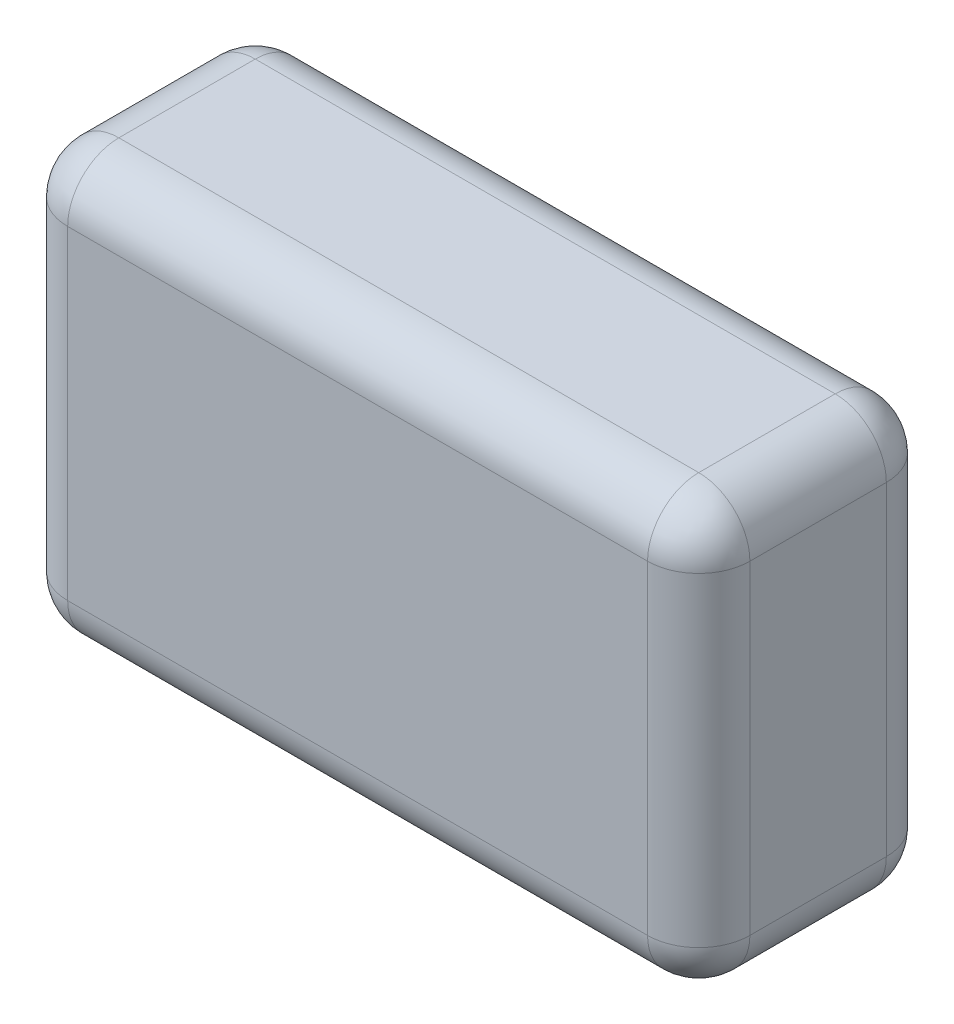
ISO-10303-21;
HEADER;
FILE_DESCRIPTION(('STEP AP214'),'2;1');
FILE_NAME('part.step','',(''),(''),'','','');
FILE_SCHEMA(('AUTOMOTIVE_DESIGN { 1 0 10303 214 1 1 1 1 }'));
ENDSEC;
DATA;
#1=APPLICATION_CONTEXT('core data for automotive mechanical design processes');
#2=APPLICATION_PROTOCOL_DEFINITION('international standard','automotive_design',2000,#1);
#3=PRODUCT_CONTEXT('',#1,'mechanical');
#4=PRODUCT('Part','Part','',(#3));
#5=PRODUCT_RELATED_PRODUCT_CATEGORY('part','',(#4));
#6=PRODUCT_DEFINITION_FORMATION('','',#4);
#7=PRODUCT_DEFINITION_CONTEXT('part definition',#1,'design');
#8=PRODUCT_DEFINITION('design','',#6,#7);
#9=PRODUCT_DEFINITION_SHAPE('','',#8);
#10=(LENGTH_UNIT() NAMED_UNIT(*) SI_UNIT(.MILLI.,.METRE.));
#11=(NAMED_UNIT(*) PLANE_ANGLE_UNIT() SI_UNIT($,.RADIAN.));
#12=(NAMED_UNIT(*) SI_UNIT($,.STERADIAN.) SOLID_ANGLE_UNIT());
#13=UNCERTAINTY_MEASURE_WITH_UNIT(LENGTH_MEASURE(1.E-05),#10,'distance_accuracy_value','');
#14=(GEOMETRIC_REPRESENTATION_CONTEXT(3) GLOBAL_UNCERTAINTY_ASSIGNED_CONTEXT((#13)) GLOBAL_UNIT_ASSIGNED_CONTEXT((#10,
#11,#12)) REPRESENTATION_CONTEXT('',''));
#15=CARTESIAN_POINT('',(0.,0.,0.));
#16=DIRECTION('',(0.,0.,1.));
#17=DIRECTION('',(1.,0.,0.));
#18=AXIS2_PLACEMENT_3D('',#15,#16,#17);
#19=CARTESIAN_POINT('',(20.,25.,-7.));
#20=DIRECTION('',(-1.,0.,0.));
#21=DIRECTION('',(0.,0.,1.));
#22=AXIS2_PLACEMENT_3D('',#19,#20,#21);
#23=PLANE('',#22);
#24=DIRECTION('',(0.,-1.,0.));
#25=VECTOR('',#24,1.);
#26=CARTESIAN_POINT('',(20.,25.,4.));
#27=LINE('',#26,#25);
#28=CARTESIAN_POINT('',(20.,22.,4.));
#29=VERTEX_POINT('',#28);
#30=CARTESIAN_POINT('',(20.,3.,4.));
#31=VERTEX_POINT('',#30);
#32=EDGE_CURVE('E157',#29,#31,#27,.T.);
#33=ORIENTED_EDGE('',*,*,#32,.T.);
#34=DIRECTION('',(0.,0.,-1.));
#35=VECTOR('',#34,1.);
#36=CARTESIAN_POINT('',(20.,3.,-7.));
#37=LINE('',#36,#35);
#38=CARTESIAN_POINT('',(20.,3.,-4.));
#39=VERTEX_POINT('',#38);
#40=EDGE_CURVE('E269',#31,#39,#37,.T.);
#41=ORIENTED_EDGE('',*,*,#40,.T.);
#42=DIRECTION('',(0.,-1.,0.));
#43=VECTOR('',#42,1.);
#44=CARTESIAN_POINT('',(20.,25.,-4.));
#45=LINE('',#44,#43);
#46=CARTESIAN_POINT('',(20.,22.,-4.));
#47=VERTEX_POINT('',#46);
#48=EDGE_CURVE('E272',#39,#47,#45,.F.);
#49=ORIENTED_EDGE('',*,*,#48,.T.);
#50=DIRECTION('',(0.,0.,-1.));
#51=VECTOR('',#50,1.);
#52=CARTESIAN_POINT('',(20.,22.,7.));
#53=LINE('',#52,#51);
#54=EDGE_CURVE('E275',#47,#29,#53,.F.);
#55=ORIENTED_EDGE('',*,*,#54,.T.);
#56=EDGE_LOOP('',(#33,#41,#49,#55));
#57=FACE_BOUND('',#56,.T.);
#58=ADVANCED_FACE('F37',(#57),#23,.F.);
#59=CARTESIAN_POINT('',(-20.,25.,-7.));
#60=DIRECTION('',(0.,0.,1.));
#61=DIRECTION('',(1.,0.,0.));
#62=AXIS2_PLACEMENT_3D('',#59,#60,#61);
#63=PLANE('',#62);
#64=DIRECTION('',(-1.,0.,0.));
#65=VECTOR('',#64,1.);
#66=CARTESIAN_POINT('',(20.,22.,-7.));
#67=LINE('',#66,#65);
#68=CARTESIAN_POINT('',(-17.,22.,-7.));
#69=VERTEX_POINT('',#68);
#70=CARTESIAN_POINT('',(17.,22.,-7.));
#71=VERTEX_POINT('',#70);
#72=EDGE_CURVE('E264',#69,#71,#67,.F.);
#73=ORIENTED_EDGE('',*,*,#72,.T.);
#74=DIRECTION('',(0.,-1.,0.));
#75=VECTOR('',#74,1.);
#76=CARTESIAN_POINT('',(17.,25.,-7.));
#77=LINE('',#76,#75);
#78=CARTESIAN_POINT('',(17.,3.,-7.));
#79=VERTEX_POINT('',#78);
#80=EDGE_CURVE('E261',#71,#79,#77,.T.);
#81=ORIENTED_EDGE('',*,*,#80,.T.);
#82=DIRECTION('',(-1.,0.,0.));
#83=VECTOR('',#82,1.);
#84=CARTESIAN_POINT('',(-20.,3.,-7.));
#85=LINE('',#84,#83);
#86=CARTESIAN_POINT('',(-17.,3.,-7.));
#87=VERTEX_POINT('',#86);
#88=EDGE_CURVE('E266',#79,#87,#85,.T.);
#89=ORIENTED_EDGE('',*,*,#88,.T.);
#90=DIRECTION('',(0.,-1.,0.));
#91=VECTOR('',#90,1.);
#92=CARTESIAN_POINT('',(-17.,25.,-7.));
#93=LINE('',#92,#91);
#94=EDGE_CURVE('E217',#87,#69,#93,.F.);
#95=ORIENTED_EDGE('',*,*,#94,.T.);
#96=EDGE_LOOP('',(#73,#81,#89,#95));
#97=FACE_BOUND('',#96,.T.);
#98=ADVANCED_FACE('F308',(#97),#63,.F.);
#99=CARTESIAN_POINT('',(-20.,25.,-7.));
#100=DIRECTION('',(1.,0.,0.));
#101=DIRECTION('',(0.,0.,-1.));
#102=AXIS2_PLACEMENT_3D('',#99,#100,#101);
#103=PLANE('',#102);
#104=DIRECTION('',(0.,0.,1.));
#105=VECTOR('',#104,1.);
#106=CARTESIAN_POINT('',(-20.,22.,-7.));
#107=LINE('',#106,#105);
#108=CARTESIAN_POINT('',(-20.,22.,4.));
#109=VERTEX_POINT('',#108);
#110=CARTESIAN_POINT('',(-20.,22.,-4.));
#111=VERTEX_POINT('',#110);
#112=EDGE_CURVE('E46',#109,#111,#107,.F.);
#113=ORIENTED_EDGE('',*,*,#112,.T.);
#114=DIRECTION('',(0.,-1.,0.));
#115=VECTOR('',#114,1.);
#116=CARTESIAN_POINT('',(-20.,25.,-4.));
#117=LINE('',#116,#115);
#118=CARTESIAN_POINT('',(-20.,3.,-4.));
#119=VERTEX_POINT('',#118);
#120=EDGE_CURVE('E11',#111,#119,#117,.T.);
#121=ORIENTED_EDGE('',*,*,#120,.T.);
#122=DIRECTION('',(0.,0.,1.));
#123=VECTOR('',#122,1.);
#124=CARTESIAN_POINT('',(-20.,3.,-7.));
#125=LINE('',#124,#123);
#126=CARTESIAN_POINT('',(-20.,3.,4.));
#127=VERTEX_POINT('',#126);
#128=EDGE_CURVE('E220',#119,#127,#125,.T.);
#129=ORIENTED_EDGE('',*,*,#128,.T.);
#130=DIRECTION('',(0.,-1.,0.));
#131=VECTOR('',#130,1.);
#132=CARTESIAN_POINT('',(-20.,25.,4.));
#133=LINE('',#132,#131);
#134=EDGE_CURVE('E57',#127,#109,#133,.F.);
#135=ORIENTED_EDGE('',*,*,#134,.T.);
#136=EDGE_LOOP('',(#113,#121,#129,#135));
#137=FACE_BOUND('',#136,.T.);
#138=ADVANCED_FACE('F219',(#137),#103,.F.);
#139=CARTESIAN_POINT('',(-20.,25.,7.));
#140=DIRECTION('',(0.,0.,-1.));
#141=DIRECTION('',(-1.,0.,0.));
#142=AXIS2_PLACEMENT_3D('',#139,#140,#141);
#143=PLANE('',#142);
#144=DIRECTION('',(0.,-1.,0.));
#145=VECTOR('',#144,1.);
#146=CARTESIAN_POINT('',(-17.,25.,7.));
#147=LINE('',#146,#145);
#148=CARTESIAN_POINT('',(-17.,22.,7.));
#149=VERTEX_POINT('',#148);
#150=CARTESIAN_POINT('',(-17.,3.,7.));
#151=VERTEX_POINT('',#150);
#152=EDGE_CURVE('E135',#149,#151,#147,.T.);
#153=ORIENTED_EDGE('',*,*,#152,.T.);
#154=DIRECTION('',(1.,0.,0.));
#155=VECTOR('',#154,1.);
#156=CARTESIAN_POINT('',(-20.,3.,7.));
#157=LINE('',#156,#155);
#158=CARTESIAN_POINT('',(17.,3.,7.));
#159=VERTEX_POINT('',#158);
#160=EDGE_CURVE('E131',#151,#159,#157,.T.);
#161=ORIENTED_EDGE('',*,*,#160,.T.);
#162=DIRECTION('',(0.,-1.,0.));
#163=VECTOR('',#162,1.);
#164=CARTESIAN_POINT('',(17.,25.,7.));
#165=LINE('',#164,#163);
#166=CARTESIAN_POINT('',(17.,22.,7.));
#167=VERTEX_POINT('',#166);
#168=EDGE_CURVE('E125',#159,#167,#165,.F.);
#169=ORIENTED_EDGE('',*,*,#168,.T.);
#170=DIRECTION('',(1.,0.,0.));
#171=VECTOR('',#170,1.);
#172=CARTESIAN_POINT('',(-20.,22.,7.));
#173=LINE('',#172,#171);
#174=EDGE_CURVE('E128',#167,#149,#173,.F.);
#175=ORIENTED_EDGE('',*,*,#174,.T.);
#176=EDGE_LOOP('',(#153,#161,#169,#175));
#177=FACE_BOUND('',#176,.T.);
#178=ADVANCED_FACE('F127',(#177),#143,.F.);
#179=CARTESIAN_POINT('',(0.,25.,0.));
#180=DIRECTION('',(0.,1.,0.));
#181=DIRECTION('',(0.,0.,1.));
#182=AXIS2_PLACEMENT_3D('',#179,#180,#181);
#183=PLANE('',#182);
#184=DIRECTION('',(0.,0.,-1.));
#185=VECTOR('',#184,1.);
#186=CARTESIAN_POINT('',(17.,25.,-7.));
#187=LINE('',#186,#185);
#188=CARTESIAN_POINT('',(17.,25.,4.));
#189=VERTEX_POINT('',#188);
#190=CARTESIAN_POINT('',(17.,25.,-4.));
#191=VERTEX_POINT('',#190);
#192=EDGE_CURVE('E257',#189,#191,#187,.T.);
#193=ORIENTED_EDGE('',*,*,#192,.T.);
#194=DIRECTION('',(-1.,0.,0.));
#195=VECTOR('',#194,1.);
#196=CARTESIAN_POINT('',(-20.,25.,-4.));
#197=LINE('',#196,#195);
#198=CARTESIAN_POINT('',(-17.,25.,-4.));
#199=VERTEX_POINT('',#198);
#200=EDGE_CURVE('E224',#191,#199,#197,.T.);
#201=ORIENTED_EDGE('',*,*,#200,.T.);
#202=DIRECTION('',(0.,0.,1.));
#203=VECTOR('',#202,1.);
#204=CARTESIAN_POINT('',(-17.,25.,7.));
#205=LINE('',#204,#203);
#206=CARTESIAN_POINT('',(-17.,25.,4.));
#207=VERTEX_POINT('',#206);
#208=EDGE_CURVE('E255',#199,#207,#205,.T.);
#209=ORIENTED_EDGE('',*,*,#208,.T.);
#210=DIRECTION('',(1.,0.,0.));
#211=VECTOR('',#210,1.);
#212=CARTESIAN_POINT('',(20.,25.,4.));
#213=LINE('',#212,#211);
#214=EDGE_CURVE('E259',#207,#189,#213,.T.);
#215=ORIENTED_EDGE('',*,*,#214,.T.);
#216=EDGE_LOOP('',(#193,#201,#209,#215));
#217=FACE_BOUND('',#216,.T.);
#218=ADVANCED_FACE('F519',(#217),#183,.T.);
#219=CARTESIAN_POINT('',(0.,0.,0.));
#220=DIRECTION('',(0.,1.,0.));
#221=DIRECTION('',(0.,0.,1.));
#222=AXIS2_PLACEMENT_3D('',#219,#220,#221);
#223=PLANE('',#222);
#224=DIRECTION('',(0.,0.,-1.));
#225=VECTOR('',#224,1.);
#226=CARTESIAN_POINT('',(17.,0.,0.));
#227=LINE('',#226,#225);
#228=CARTESIAN_POINT('',(17.,0.,-4.));
#229=VERTEX_POINT('',#228);
#230=CARTESIAN_POINT('',(17.,0.,4.));
#231=VERTEX_POINT('',#230);
#232=EDGE_CURVE('E279',#229,#231,#227,.F.);
#233=ORIENTED_EDGE('',*,*,#232,.T.);
#234=DIRECTION('',(1.,0.,0.));
#235=VECTOR('',#234,1.);
#236=CARTESIAN_POINT('',(0.,0.,4.));
#237=LINE('',#236,#235);
#238=CARTESIAN_POINT('',(-17.,0.,4.));
#239=VERTEX_POINT('',#238);
#240=EDGE_CURVE('E277',#231,#239,#237,.F.);
#241=ORIENTED_EDGE('',*,*,#240,.T.);
#242=DIRECTION('',(0.,0.,1.));
#243=VECTOR('',#242,1.);
#244=CARTESIAN_POINT('',(-17.,0.,0.));
#245=LINE('',#244,#243);
#246=CARTESIAN_POINT('',(-17.,0.,-4.));
#247=VERTEX_POINT('',#246);
#248=EDGE_CURVE('E237',#239,#247,#245,.F.);
#249=ORIENTED_EDGE('',*,*,#248,.T.);
#250=DIRECTION('',(-1.,0.,0.));
#251=VECTOR('',#250,1.);
#252=CARTESIAN_POINT('',(0.,0.,-4.));
#253=LINE('',#252,#251);
#254=EDGE_CURVE('E281',#247,#229,#253,.F.);
#255=ORIENTED_EDGE('',*,*,#254,.T.);
#256=EDGE_LOOP('',(#233,#241,#249,#255));
#257=FACE_BOUND('',#256,.T.);
#258=ADVANCED_FACE('F287',(#257),#223,.F.);
#259=CARTESIAN_POINT('',(0.,22.,-4.));
#260=DIRECTION('',(1.,0.,0.));
#261=DIRECTION('',(0.,0.,-1.));
#262=AXIS2_PLACEMENT_3D('',#259,#260,#261);
#263=CYLINDRICAL_SURFACE('',#262,3.);
#264=CARTESIAN_POINT('',(-17.,22.,-4.));
#265=DIRECTION('',(-1.,0.,0.));
#266=DIRECTION('',(0.,0.,1.));
#267=AXIS2_PLACEMENT_3D('',#264,#265,#266);
#268=CIRCLE('',#267,3.);
#269=EDGE_CURVE('E41',#199,#69,#268,.T.);
#270=ORIENTED_EDGE('',*,*,#269,.F.);
#271=ORIENTED_EDGE('',*,*,#200,.F.);
#272=CARTESIAN_POINT('',(17.,22.,-4.));
#273=DIRECTION('',(1.,0.,0.));
#274=DIRECTION('',(0.,1.,0.));
#275=AXIS2_PLACEMENT_3D('',#272,#273,#274);
#276=CIRCLE('',#275,3.);
#277=EDGE_CURVE('E196',#71,#191,#276,.T.);
#278=ORIENTED_EDGE('',*,*,#277,.F.);
#279=ORIENTED_EDGE('',*,*,#72,.F.);
#280=EDGE_LOOP('',(#270,#271,#278,#279));
#281=FACE_BOUND('',#280,.T.);
#282=ADVANCED_FACE('F39',(#281),#263,.T.);
#283=CARTESIAN_POINT('',(-17.,22.,-4.));
#284=DIRECTION('',(0.,0.,-1.));
#285=DIRECTION('',(-1.,0.,0.));
#286=AXIS2_PLACEMENT_3D('',#283,#284,#285);
#287=SPHERICAL_SURFACE('',#286,3.);
#288=CARTESIAN_POINT('',(-17.,22.,-4.));
#289=DIRECTION('',(0.,0.,-1.));
#290=DIRECTION('',(-1.,0.,0.));
#291=AXIS2_PLACEMENT_3D('',#288,#289,#290);
#292=CIRCLE('',#291,3.);
#293=EDGE_CURVE('E192',#199,#111,#292,.F.);
#294=ORIENTED_EDGE('',*,*,#293,.F.);
#295=ORIENTED_EDGE('',*,*,#269,.T.);
#296=CARTESIAN_POINT('',(-17.,22.,-4.));
#297=DIRECTION('',(0.,1.,0.));
#298=DIRECTION('',(0.,0.,1.));
#299=AXIS2_PLACEMENT_3D('',#296,#297,#298);
#300=CIRCLE('',#299,3.);
#301=EDGE_CURVE('E194',#111,#69,#300,.F.);
#302=ORIENTED_EDGE('',*,*,#301,.F.);
#303=EDGE_LOOP('',(#294,#295,#302));
#304=FACE_BOUND('',#303,.T.);
#305=ADVANCED_FACE('F207',(#304),#287,.T.);
#306=CARTESIAN_POINT('',(17.,22.,-4.));
#307=DIRECTION('',(0.,1.,0.));
#308=DIRECTION('',(0.,0.,1.));
#309=AXIS2_PLACEMENT_3D('',#306,#307,#308);
#310=SPHERICAL_SURFACE('',#309,3.);
#311=CARTESIAN_POINT('',(17.,22.,-4.));
#312=DIRECTION('',(0.,1.,0.));
#313=DIRECTION('',(0.,0.,1.));
#314=AXIS2_PLACEMENT_3D('',#311,#312,#313);
#315=CIRCLE('',#314,3.);
#316=EDGE_CURVE('E186',#71,#47,#315,.F.);
#317=ORIENTED_EDGE('',*,*,#316,.F.);
#318=ORIENTED_EDGE('',*,*,#277,.T.);
#319=CARTESIAN_POINT('',(17.,22.,-4.));
#320=DIRECTION('',(0.,0.,-1.));
#321=DIRECTION('',(-1.,0.,0.));
#322=AXIS2_PLACEMENT_3D('',#319,#320,#321);
#323=CIRCLE('',#322,3.);
#324=EDGE_CURVE('E189',#47,#191,#323,.F.);
#325=ORIENTED_EDGE('',*,*,#324,.F.);
#326=EDGE_LOOP('',(#317,#318,#325));
#327=FACE_BOUND('',#326,.T.);
#328=ADVANCED_FACE('F484',(#327),#310,.T.);
#329=CARTESIAN_POINT('',(-17.,25.,-4.));
#330=DIRECTION('',(0.,-1.,0.));
#331=DIRECTION('',(0.,0.,-1.));
#332=AXIS2_PLACEMENT_3D('',#329,#330,#331);
#333=CYLINDRICAL_SURFACE('',#332,3.);
#334=ORIENTED_EDGE('',*,*,#301,.T.);
#335=ORIENTED_EDGE('',*,*,#94,.F.);
#336=CARTESIAN_POINT('',(-17.,3.,-4.));
#337=DIRECTION('',(0.,-1.,0.));
#338=DIRECTION('',(0.,0.,-1.));
#339=AXIS2_PLACEMENT_3D('',#336,#337,#338);
#340=CIRCLE('',#339,3.);
#341=EDGE_CURVE('E180',#119,#87,#340,.T.);
#342=ORIENTED_EDGE('',*,*,#341,.F.);
#343=ORIENTED_EDGE('',*,*,#120,.F.);
#344=EDGE_LOOP('',(#334,#335,#342,#343));
#345=FACE_BOUND('',#344,.T.);
#346=ADVANCED_FACE('F215',(#345),#333,.T.);
#347=CARTESIAN_POINT('',(-17.,22.,0.));
#348=DIRECTION('',(0.,0.,-1.));
#349=DIRECTION('',(-1.,0.,0.));
#350=AXIS2_PLACEMENT_3D('',#347,#348,#349);
#351=CYLINDRICAL_SURFACE('',#350,3.);
#352=ORIENTED_EDGE('',*,*,#293,.T.);
#353=ORIENTED_EDGE('',*,*,#112,.F.);
#354=CARTESIAN_POINT('',(-17.,22.,4.));
#355=DIRECTION('',(0.,0.,1.));
#356=DIRECTION('',(1.,0.,0.));
#357=AXIS2_PLACEMENT_3D('',#354,#355,#356);
#358=CIRCLE('',#357,3.);
#359=EDGE_CURVE('E177',#207,#109,#358,.T.);
#360=ORIENTED_EDGE('',*,*,#359,.F.);
#361=ORIENTED_EDGE('',*,*,#208,.F.);
#362=EDGE_LOOP('',(#352,#353,#360,#361));
#363=FACE_BOUND('',#362,.T.);
#364=ADVANCED_FACE('F464',(#363),#351,.T.);
#365=CARTESIAN_POINT('',(0.,22.,4.));
#366=DIRECTION('',(-1.,0.,0.));
#367=DIRECTION('',(0.,0.,1.));
#368=AXIS2_PLACEMENT_3D('',#365,#366,#367);
#369=CYLINDRICAL_SURFACE('',#368,3.);
#370=CARTESIAN_POINT('',(17.,22.,4.));
#371=DIRECTION('',(1.,0.,0.));
#372=DIRECTION('',(0.,0.,-1.));
#373=AXIS2_PLACEMENT_3D('',#370,#371,#372);
#374=CIRCLE('',#373,3.);
#375=EDGE_CURVE('E142',#189,#167,#374,.T.);
#376=ORIENTED_EDGE('',*,*,#375,.F.);
#377=ORIENTED_EDGE('',*,*,#214,.F.);
#378=CARTESIAN_POINT('',(-17.,22.,4.));
#379=DIRECTION('',(-1.,0.,0.));
#380=DIRECTION('',(0.,0.,1.));
#381=AXIS2_PLACEMENT_3D('',#378,#379,#380);
#382=CIRCLE('',#381,3.);
#383=EDGE_CURVE('E145',#149,#207,#382,.T.);
#384=ORIENTED_EDGE('',*,*,#383,.F.);
#385=ORIENTED_EDGE('',*,*,#174,.F.);
#386=EDGE_LOOP('',(#376,#377,#384,#385));
#387=FACE_BOUND('',#386,.T.);
#388=ADVANCED_FACE('F140',(#387),#369,.T.);
#389=CARTESIAN_POINT('',(17.,22.,0.));
#390=DIRECTION('',(0.,0.,1.));
#391=DIRECTION('',(1.,0.,0.));
#392=AXIS2_PLACEMENT_3D('',#389,#390,#391);
#393=CYLINDRICAL_SURFACE('',#392,3.);
#394=ORIENTED_EDGE('',*,*,#324,.T.);
#395=ORIENTED_EDGE('',*,*,#192,.F.);
#396=CARTESIAN_POINT('',(17.,22.,4.));
#397=DIRECTION('',(0.,0.,1.));
#398=DIRECTION('',(0.,-1.,0.));
#399=AXIS2_PLACEMENT_3D('',#396,#397,#398);
#400=CIRCLE('',#399,3.);
#401=EDGE_CURVE('E154',#29,#189,#400,.T.);
#402=ORIENTED_EDGE('',*,*,#401,.F.);
#403=ORIENTED_EDGE('',*,*,#54,.F.);
#404=EDGE_LOOP('',(#394,#395,#402,#403));
#405=FACE_BOUND('',#404,.T.);
#406=ADVANCED_FACE('F443',(#405),#393,.T.);
#407=CARTESIAN_POINT('',(17.,25.,-4.));
#408=DIRECTION('',(0.,-1.,0.));
#409=DIRECTION('',(0.,0.,-1.));
#410=AXIS2_PLACEMENT_3D('',#407,#408,#409);
#411=CYLINDRICAL_SURFACE('',#410,3.);
#412=ORIENTED_EDGE('',*,*,#316,.T.);
#413=ORIENTED_EDGE('',*,*,#48,.F.);
#414=CARTESIAN_POINT('',(17.,3.,-4.));
#415=DIRECTION('',(0.,-1.,0.));
#416=DIRECTION('',(0.,0.,-1.));
#417=AXIS2_PLACEMENT_3D('',#414,#415,#416);
#418=CIRCLE('',#417,3.);
#419=EDGE_CURVE('E172',#79,#39,#418,.T.);
#420=ORIENTED_EDGE('',*,*,#419,.F.);
#421=ORIENTED_EDGE('',*,*,#80,.F.);
#422=EDGE_LOOP('',(#412,#413,#420,#421));
#423=FACE_BOUND('',#422,.T.);
#424=ADVANCED_FACE('F305',(#423),#411,.T.);
#425=CARTESIAN_POINT('',(-20.,3.,-4.));
#426=DIRECTION('',(-1.,0.,0.));
#427=DIRECTION('',(0.,0.,1.));
#428=AXIS2_PLACEMENT_3D('',#425,#426,#427);
#429=CYLINDRICAL_SURFACE('',#428,3.);
#430=CARTESIAN_POINT('',(-17.,3.,-4.));
#431=DIRECTION('',(-1.,0.,0.));
#432=DIRECTION('',(0.,0.,1.));
#433=AXIS2_PLACEMENT_3D('',#430,#431,#432);
#434=CIRCLE('',#433,3.);
#435=EDGE_CURVE('E183',#87,#247,#434,.T.);
#436=ORIENTED_EDGE('',*,*,#435,.F.);
#437=ORIENTED_EDGE('',*,*,#88,.F.);
#438=CARTESIAN_POINT('',(17.,3.,-4.));
#439=DIRECTION('',(1.,0.,0.));
#440=DIRECTION('',(0.,0.,-1.));
#441=AXIS2_PLACEMENT_3D('',#438,#439,#440);
#442=CIRCLE('',#441,3.);
#443=EDGE_CURVE('E170',#229,#79,#442,.T.);
#444=ORIENTED_EDGE('',*,*,#443,.F.);
#445=ORIENTED_EDGE('',*,*,#254,.F.);
#446=EDGE_LOOP('',(#436,#437,#444,#445));
#447=FACE_BOUND('',#446,.T.);
#448=ADVANCED_FACE('F291',(#447),#429,.T.);
#449=CARTESIAN_POINT('',(-17.,3.,-4.));
#450=DIRECTION('',(0.,0.,-1.));
#451=DIRECTION('',(0.,1.,0.));
#452=AXIS2_PLACEMENT_3D('',#449,#450,#451);
#453=SPHERICAL_SURFACE('',#452,3.);
#454=ORIENTED_EDGE('',*,*,#341,.T.);
#455=ORIENTED_EDGE('',*,*,#435,.T.);
#456=CARTESIAN_POINT('',(-17.,3.,-4.));
#457=DIRECTION('',(0.,0.,-1.));
#458=DIRECTION('',(-1.,0.,0.));
#459=AXIS2_PLACEMENT_3D('',#456,#457,#458);
#460=CIRCLE('',#459,3.);
#461=EDGE_CURVE('E162',#119,#247,#460,.F.);
#462=ORIENTED_EDGE('',*,*,#461,.F.);
#463=EDGE_LOOP('',(#454,#455,#462));
#464=FACE_BOUND('',#463,.T.);
#465=ADVANCED_FACE('F295',(#464),#453,.T.);
#466=CARTESIAN_POINT('',(-17.,22.,4.));
#467=DIRECTION('',(0.,1.,0.));
#468=DIRECTION('',(0.,0.,1.));
#469=AXIS2_PLACEMENT_3D('',#466,#467,#468);
#470=SPHERICAL_SURFACE('',#469,3.);
#471=ORIENTED_EDGE('',*,*,#383,.T.);
#472=ORIENTED_EDGE('',*,*,#359,.T.);
#473=CARTESIAN_POINT('',(-17.,22.,4.));
#474=DIRECTION('',(0.,1.,0.));
#475=DIRECTION('',(0.,0.,1.));
#476=AXIS2_PLACEMENT_3D('',#473,#474,#475);
#477=CIRCLE('',#476,3.);
#478=EDGE_CURVE('E158',#149,#109,#477,.F.);
#479=ORIENTED_EDGE('',*,*,#478,.F.);
#480=EDGE_LOOP('',(#471,#472,#479));
#481=FACE_BOUND('',#480,.T.);
#482=ADVANCED_FACE('F297',(#481),#470,.T.);
#483=CARTESIAN_POINT('',(17.,22.,4.));
#484=DIRECTION('',(0.,1.,0.));
#485=DIRECTION('',(0.,0.,1.));
#486=AXIS2_PLACEMENT_3D('',#483,#484,#485);
#487=SPHERICAL_SURFACE('',#486,3.);
#488=ORIENTED_EDGE('',*,*,#401,.T.);
#489=ORIENTED_EDGE('',*,*,#375,.T.);
#490=CARTESIAN_POINT('',(17.,22.,4.));
#491=DIRECTION('',(0.,1.,0.));
#492=DIRECTION('',(0.,0.,1.));
#493=AXIS2_PLACEMENT_3D('',#490,#491,#492);
#494=CIRCLE('',#493,3.);
#495=EDGE_CURVE('E151',#29,#167,#494,.F.);
#496=ORIENTED_EDGE('',*,*,#495,.F.);
#497=EDGE_LOOP('',(#488,#489,#496));
#498=FACE_BOUND('',#497,.T.);
#499=ADVANCED_FACE('F150',(#498),#487,.T.);
#500=CARTESIAN_POINT('',(17.,3.,-4.));
#501=DIRECTION('',(0.,0.,-1.));
#502=DIRECTION('',(-1.,0.,0.));
#503=AXIS2_PLACEMENT_3D('',#500,#501,#502);
#504=SPHERICAL_SURFACE('',#503,3.);
#505=ORIENTED_EDGE('',*,*,#443,.T.);
#506=ORIENTED_EDGE('',*,*,#419,.T.);
#507=CARTESIAN_POINT('',(17.,3.,-4.));
#508=DIRECTION('',(0.,0.,-1.));
#509=DIRECTION('',(-1.,0.,0.));
#510=AXIS2_PLACEMENT_3D('',#507,#508,#509);
#511=CIRCLE('',#510,3.);
#512=EDGE_CURVE('E159',#229,#39,#511,.F.);
#513=ORIENTED_EDGE('',*,*,#512,.F.);
#514=EDGE_LOOP('',(#505,#506,#513));
#515=FACE_BOUND('',#514,.T.);
#516=ADVANCED_FACE('F338',(#515),#504,.T.);
#517=CARTESIAN_POINT('',(-17.,3.,-7.));
#518=DIRECTION('',(0.,0.,1.));
#519=DIRECTION('',(1.,0.,0.));
#520=AXIS2_PLACEMENT_3D('',#517,#518,#519);
#521=CYLINDRICAL_SURFACE('',#520,3.);
#522=ORIENTED_EDGE('',*,*,#461,.T.);
#523=ORIENTED_EDGE('',*,*,#248,.F.);
#524=CARTESIAN_POINT('',(-17.,3.,4.));
#525=DIRECTION('',(0.,0.,1.));
#526=DIRECTION('',(1.,0.,0.));
#527=AXIS2_PLACEMENT_3D('',#524,#525,#526);
#528=CIRCLE('',#527,3.);
#529=EDGE_CURVE('E164',#127,#239,#528,.T.);
#530=ORIENTED_EDGE('',*,*,#529,.F.);
#531=ORIENTED_EDGE('',*,*,#128,.F.);
#532=EDGE_LOOP('',(#522,#523,#530,#531));
#533=FACE_BOUND('',#532,.T.);
#534=ADVANCED_FACE('F236',(#533),#521,.T.);
#535=CARTESIAN_POINT('',(-17.,25.,4.));
#536=DIRECTION('',(0.,-1.,0.));
#537=DIRECTION('',(0.,0.,-1.));
#538=AXIS2_PLACEMENT_3D('',#535,#536,#537);
#539=CYLINDRICAL_SURFACE('',#538,3.);
#540=ORIENTED_EDGE('',*,*,#478,.T.);
#541=ORIENTED_EDGE('',*,*,#134,.F.);
#542=CARTESIAN_POINT('',(-17.,3.,4.));
#543=DIRECTION('',(0.,-1.,0.));
#544=DIRECTION('',(0.,0.,-1.));
#545=AXIS2_PLACEMENT_3D('',#542,#543,#544);
#546=CIRCLE('',#545,3.);
#547=EDGE_CURVE('E231',#151,#127,#546,.T.);
#548=ORIENTED_EDGE('',*,*,#547,.F.);
#549=ORIENTED_EDGE('',*,*,#152,.F.);
#550=EDGE_LOOP('',(#540,#541,#548,#549));
#551=FACE_BOUND('',#550,.T.);
#552=ADVANCED_FACE('F228',(#551),#539,.T.);
#553=CARTESIAN_POINT('',(17.,25.,4.));
#554=DIRECTION('',(0.,-1.,0.));
#555=DIRECTION('',(0.,0.,-1.));
#556=AXIS2_PLACEMENT_3D('',#553,#554,#555);
#557=CYLINDRICAL_SURFACE('',#556,3.);
#558=ORIENTED_EDGE('',*,*,#495,.T.);
#559=ORIENTED_EDGE('',*,*,#168,.F.);
#560=CARTESIAN_POINT('',(17.,3.,4.));
#561=DIRECTION('',(0.,-1.,0.));
#562=DIRECTION('',(0.,0.,-1.));
#563=AXIS2_PLACEMENT_3D('',#560,#561,#562);
#564=CIRCLE('',#563,3.);
#565=EDGE_CURVE('E242',#31,#159,#564,.T.);
#566=ORIENTED_EDGE('',*,*,#565,.F.);
#567=ORIENTED_EDGE('',*,*,#32,.F.);
#568=EDGE_LOOP('',(#558,#559,#566,#567));
#569=FACE_BOUND('',#568,.T.);
#570=ADVANCED_FACE('F156',(#569),#557,.T.);
#571=CARTESIAN_POINT('',(17.,3.,-7.));
#572=DIRECTION('',(0.,0.,-1.));
#573=DIRECTION('',(-1.,0.,0.));
#574=AXIS2_PLACEMENT_3D('',#571,#572,#573);
#575=CYLINDRICAL_SURFACE('',#574,3.);
#576=ORIENTED_EDGE('',*,*,#512,.T.);
#577=ORIENTED_EDGE('',*,*,#40,.F.);
#578=CARTESIAN_POINT('',(17.,3.,4.));
#579=DIRECTION('',(0.,0.,1.));
#580=DIRECTION('',(1.,0.,0.));
#581=AXIS2_PLACEMENT_3D('',#578,#579,#580);
#582=CIRCLE('',#581,3.);
#583=EDGE_CURVE('E245',#231,#31,#582,.T.);
#584=ORIENTED_EDGE('',*,*,#583,.F.);
#585=ORIENTED_EDGE('',*,*,#232,.F.);
#586=EDGE_LOOP('',(#576,#577,#584,#585));
#587=FACE_BOUND('',#586,.T.);
#588=ADVANCED_FACE('F328',(#587),#575,.T.);
#589=CARTESIAN_POINT('',(-17.,3.,4.));
#590=DIRECTION('',(-1.,0.,0.));
#591=DIRECTION('',(0.,-1.,0.));
#592=AXIS2_PLACEMENT_3D('',#589,#590,#591);
#593=SPHERICAL_SURFACE('',#592,3.);
#594=ORIENTED_EDGE('',*,*,#547,.T.);
#595=ORIENTED_EDGE('',*,*,#529,.T.);
#596=CARTESIAN_POINT('',(-17.,3.,4.));
#597=DIRECTION('',(-1.,0.,0.));
#598=DIRECTION('',(0.,0.,1.));
#599=AXIS2_PLACEMENT_3D('',#596,#597,#598);
#600=CIRCLE('',#599,3.);
#601=EDGE_CURVE('E241',#151,#239,#600,.F.);
#602=ORIENTED_EDGE('',*,*,#601,.F.);
#603=EDGE_LOOP('',(#594,#595,#602));
#604=FACE_BOUND('',#603,.T.);
#605=ADVANCED_FACE('F240',(#604),#593,.T.);
#606=CARTESIAN_POINT('',(17.,3.,4.));
#607=DIRECTION('',(1.,0.,0.));
#608=DIRECTION('',(0.,0.,-1.));
#609=AXIS2_PLACEMENT_3D('',#606,#607,#608);
#610=SPHERICAL_SURFACE('',#609,3.);
#611=ORIENTED_EDGE('',*,*,#583,.T.);
#612=ORIENTED_EDGE('',*,*,#565,.T.);
#613=CARTESIAN_POINT('',(17.,3.,4.));
#614=DIRECTION('',(1.,0.,0.));
#615=DIRECTION('',(0.,0.,-1.));
#616=AXIS2_PLACEMENT_3D('',#613,#614,#615);
#617=CIRCLE('',#616,3.);
#618=EDGE_CURVE('E251',#231,#159,#617,.F.);
#619=ORIENTED_EDGE('',*,*,#618,.F.);
#620=EDGE_LOOP('',(#611,#612,#619));
#621=FACE_BOUND('',#620,.T.);
#622=ADVANCED_FACE('F321',(#621),#610,.T.);
#623=CARTESIAN_POINT('',(-20.,3.,4.));
#624=DIRECTION('',(1.,0.,0.));
#625=DIRECTION('',(0.,0.,-1.));
#626=AXIS2_PLACEMENT_3D('',#623,#624,#625);
#627=CYLINDRICAL_SURFACE('',#626,3.);
#628=ORIENTED_EDGE('',*,*,#601,.T.);
#629=ORIENTED_EDGE('',*,*,#240,.F.);
#630=ORIENTED_EDGE('',*,*,#618,.T.);
#631=ORIENTED_EDGE('',*,*,#160,.F.);
#632=EDGE_LOOP('',(#628,#629,#630,#631));
#633=FACE_BOUND('',#632,.T.);
#634=ADVANCED_FACE('F318',(#633),#627,.T.);
#635=CLOSED_SHELL('',(#58,#98,#138,#178,#218,#258,#282,#305,#328,#346,#364,#388,#406,#424,#448,
#465,#482,#499,#516,#534,#552,#570,#588,#605,#622,#634));
#636=MANIFOLD_SOLID_BREP('B2',#635);
#637=ADVANCED_BREP_SHAPE_REPRESENTATION('',(#18,#636),#14);
#638=SHAPE_DEFINITION_REPRESENTATION(#9,#637);
ENDSEC;
END-ISO-10303-21;
